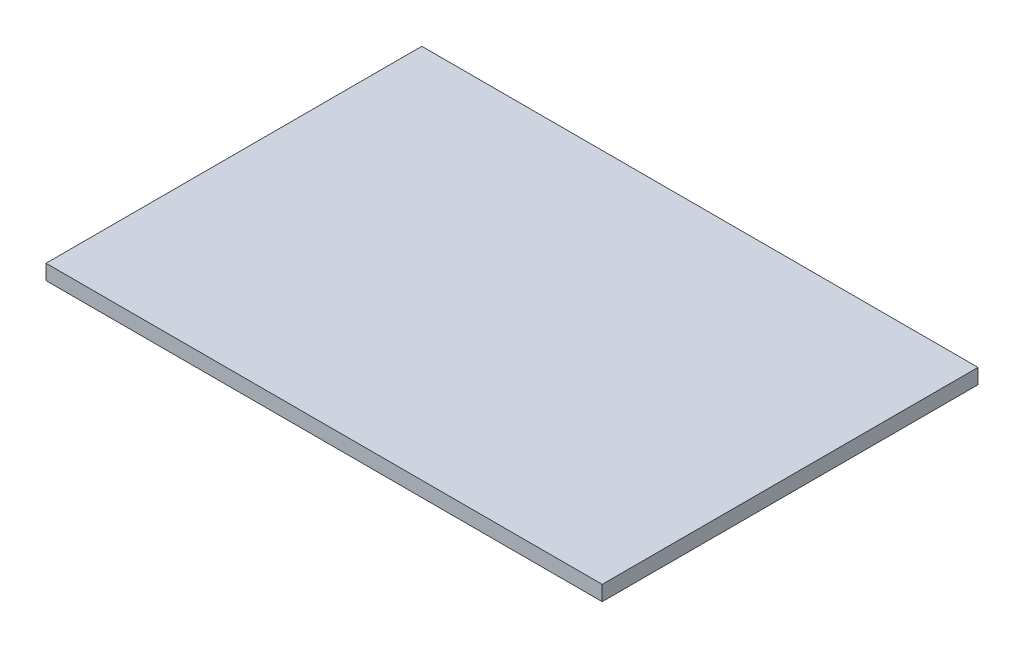
ISO-10303-21;
HEADER;
FILE_DESCRIPTION(('STEP AP214'),'2;1');
FILE_NAME('part.step','',(''),(''),'','','');
FILE_SCHEMA(('AUTOMOTIVE_DESIGN { 1 0 10303 214 1 1 1 1 }'));
ENDSEC;
DATA;
#1=APPLICATION_CONTEXT('core data for automotive mechanical design processes');
#2=APPLICATION_PROTOCOL_DEFINITION('international standard','automotive_design',2000,#1);
#3=PRODUCT_CONTEXT('',#1,'mechanical');
#4=PRODUCT('Part','Part','',(#3));
#5=PRODUCT_RELATED_PRODUCT_CATEGORY('part','',(#4));
#6=PRODUCT_DEFINITION_FORMATION('','',#4);
#7=PRODUCT_DEFINITION_CONTEXT('part definition',#1,'design');
#8=PRODUCT_DEFINITION('design','',#6,#7);
#9=PRODUCT_DEFINITION_SHAPE('','',#8);
#10=(LENGTH_UNIT() NAMED_UNIT(*) SI_UNIT(.MILLI.,.METRE.));
#11=(NAMED_UNIT(*) PLANE_ANGLE_UNIT() SI_UNIT($,.RADIAN.));
#12=(NAMED_UNIT(*) SI_UNIT($,.STERADIAN.) SOLID_ANGLE_UNIT());
#13=UNCERTAINTY_MEASURE_WITH_UNIT(LENGTH_MEASURE(1.E-05),#10,'distance_accuracy_value','');
#14=(GEOMETRIC_REPRESENTATION_CONTEXT(3) GLOBAL_UNCERTAINTY_ASSIGNED_CONTEXT((#13)) GLOBAL_UNIT_ASSIGNED_CONTEXT((#10,
#11,#12)) REPRESENTATION_CONTEXT('',''));
#15=CARTESIAN_POINT('',(0.,0.,0.));
#16=DIRECTION('',(0.,0.,1.));
#17=DIRECTION('',(1.,0.,0.));
#18=AXIS2_PLACEMENT_3D('',#15,#16,#17);
#19=CARTESIAN_POINT('',(-132.073823053412,10.,-128.97476340694));
#20=DIRECTION('',(1.,0.,0.));
#21=DIRECTION('',(0.,0.,-1.));
#22=AXIS2_PLACEMENT_3D('',#19,#20,#21);
#23=PLANE('',#22);
#24=DIRECTION('',(0.,0.,1.));
#25=VECTOR('',#24,1.);
#26=CARTESIAN_POINT('',(-132.073823053412,0.,-128.97476340694));
#27=LINE('',#26,#25);
#28=CARTESIAN_POINT('',(-132.073823053412,0.,-128.97476340694));
#29=VERTEX_POINT('',#28);
#30=CARTESIAN_POINT('',(-132.073823053412,0.,121.02523659306));
#31=VERTEX_POINT('',#30);
#32=EDGE_CURVE('E96',#29,#31,#27,.T.);
#33=ORIENTED_EDGE('',*,*,#32,.T.);
#34=DIRECTION('',(0.,-1.,0.));
#35=VECTOR('',#34,1.);
#36=CARTESIAN_POINT('',(-132.073823053412,10.,121.02523659306));
#37=LINE('',#36,#35);
#38=CARTESIAN_POINT('',(-132.073823053412,10.,121.02523659306));
#39=VERTEX_POINT('',#38);
#40=EDGE_CURVE('E11',#39,#31,#37,.T.);
#41=ORIENTED_EDGE('',*,*,#40,.F.);
#42=DIRECTION('',(0.,0.,1.));
#43=VECTOR('',#42,1.);
#44=CARTESIAN_POINT('',(-132.073823053412,10.,-128.97476340694));
#45=LINE('',#44,#43);
#46=CARTESIAN_POINT('',(-132.073823053412,10.,-128.97476340694));
#47=VERTEX_POINT('',#46);
#48=EDGE_CURVE('E84',#47,#39,#45,.T.);
#49=ORIENTED_EDGE('',*,*,#48,.F.);
#50=DIRECTION('',(0.,-1.,0.));
#51=VECTOR('',#50,1.);
#52=CARTESIAN_POINT('',(-132.073823053412,10.,-128.97476340694));
#53=LINE('',#52,#51);
#54=EDGE_CURVE('E92',#47,#29,#53,.T.);
#55=ORIENTED_EDGE('',*,*,#54,.T.);
#56=EDGE_LOOP('',(#33,#41,#49,#55));
#57=FACE_BOUND('',#56,.T.);
#58=ADVANCED_FACE('F33',(#57),#23,.F.);
#59=CARTESIAN_POINT('',(-132.073823053412,10.,121.02523659306));
#60=DIRECTION('',(0.,0.,-1.));
#61=DIRECTION('',(-1.,0.,0.));
#62=AXIS2_PLACEMENT_3D('',#59,#60,#61);
#63=PLANE('',#62);
#64=DIRECTION('',(1.,0.,0.));
#65=VECTOR('',#64,1.);
#66=CARTESIAN_POINT('',(-132.073823053412,0.,121.02523659306));
#67=LINE('',#66,#65);
#68=CARTESIAN_POINT('',(237.926176946588,0.,121.02523659306));
#69=VERTEX_POINT('',#68);
#70=EDGE_CURVE('E88',#31,#69,#67,.T.);
#71=ORIENTED_EDGE('',*,*,#70,.T.);
#72=DIRECTION('',(0.,-1.,0.));
#73=VECTOR('',#72,1.);
#74=CARTESIAN_POINT('',(237.926176946588,10.,121.02523659306));
#75=LINE('',#74,#73);
#76=CARTESIAN_POINT('',(237.926176946588,10.,121.02523659306));
#77=VERTEX_POINT('',#76);
#78=EDGE_CURVE('E41',#77,#69,#75,.T.);
#79=ORIENTED_EDGE('',*,*,#78,.F.);
#80=DIRECTION('',(1.,0.,0.));
#81=VECTOR('',#80,1.);
#82=CARTESIAN_POINT('',(-132.073823053412,10.,121.02523659306));
#83=LINE('',#82,#81);
#84=EDGE_CURVE('E79',#39,#77,#83,.T.);
#85=ORIENTED_EDGE('',*,*,#84,.F.);
#86=ORIENTED_EDGE('',*,*,#40,.T.);
#87=EDGE_LOOP('',(#71,#79,#85,#86));
#88=FACE_BOUND('',#87,.T.);
#89=ADVANCED_FACE('F87',(#88),#63,.F.);
#90=CARTESIAN_POINT('',(237.926176946588,10.,-128.97476340694));
#91=DIRECTION('',(-1.,0.,0.));
#92=DIRECTION('',(0.,0.,1.));
#93=AXIS2_PLACEMENT_3D('',#90,#91,#92);
#94=PLANE('',#93);
#95=DIRECTION('',(0.,0.,-1.));
#96=VECTOR('',#95,1.);
#97=CARTESIAN_POINT('',(237.926176946588,0.,-128.97476340694));
#98=LINE('',#97,#96);
#99=CARTESIAN_POINT('',(237.926176946588,0.,-128.97476340694));
#100=VERTEX_POINT('',#99);
#101=EDGE_CURVE('E66',#69,#100,#98,.T.);
#102=ORIENTED_EDGE('',*,*,#101,.T.);
#103=DIRECTION('',(0.,-1.,0.));
#104=VECTOR('',#103,1.);
#105=CARTESIAN_POINT('',(237.926176946588,10.,-128.97476340694));
#106=LINE('',#105,#104);
#107=CARTESIAN_POINT('',(237.926176946588,10.,-128.97476340694));
#108=VERTEX_POINT('',#107);
#109=EDGE_CURVE('E89',#108,#100,#106,.T.);
#110=ORIENTED_EDGE('',*,*,#109,.F.);
#111=DIRECTION('',(0.,0.,-1.));
#112=VECTOR('',#111,1.);
#113=CARTESIAN_POINT('',(237.926176946588,10.,-128.97476340694));
#114=LINE('',#113,#112);
#115=EDGE_CURVE('E82',#77,#108,#114,.T.);
#116=ORIENTED_EDGE('',*,*,#115,.F.);
#117=ORIENTED_EDGE('',*,*,#78,.T.);
#118=EDGE_LOOP('',(#102,#110,#116,#117));
#119=FACE_BOUND('',#118,.T.);
#120=ADVANCED_FACE('F90',(#119),#94,.F.);
#121=CARTESIAN_POINT('',(-132.073823053412,10.,-128.97476340694));
#122=DIRECTION('',(0.,0.,1.));
#123=DIRECTION('',(1.,0.,0.));
#124=AXIS2_PLACEMENT_3D('',#121,#122,#123);
#125=PLANE('',#124);
#126=DIRECTION('',(-1.,0.,0.));
#127=VECTOR('',#126,1.);
#128=CARTESIAN_POINT('',(-132.073823053412,0.,-128.97476340694));
#129=LINE('',#128,#127);
#130=EDGE_CURVE('E72',#100,#29,#129,.T.);
#131=ORIENTED_EDGE('',*,*,#130,.T.);
#132=ORIENTED_EDGE('',*,*,#54,.F.);
#133=DIRECTION('',(-1.,0.,0.));
#134=VECTOR('',#133,1.);
#135=CARTESIAN_POINT('',(-132.073823053412,10.,-128.97476340694));
#136=LINE('',#135,#134);
#137=EDGE_CURVE('E49',#108,#47,#136,.T.);
#138=ORIENTED_EDGE('',*,*,#137,.F.);
#139=ORIENTED_EDGE('',*,*,#109,.T.);
#140=EDGE_LOOP('',(#131,#132,#138,#139));
#141=FACE_BOUND('',#140,.T.);
#142=ADVANCED_FACE('F103',(#141),#125,.F.);
#143=CARTESIAN_POINT('',(0.,10.,0.));
#144=DIRECTION('',(0.,1.,0.));
#145=DIRECTION('',(0.,0.,1.));
#146=AXIS2_PLACEMENT_3D('',#143,#144,#145);
#147=PLANE('',#146);
#148=ORIENTED_EDGE('',*,*,#48,.T.);
#149=ORIENTED_EDGE('',*,*,#84,.T.);
#150=ORIENTED_EDGE('',*,*,#115,.T.);
#151=ORIENTED_EDGE('',*,*,#137,.T.);
#152=EDGE_LOOP('',(#148,#149,#150,#151));
#153=FACE_BOUND('',#152,.T.);
#154=ADVANCED_FACE('F80',(#153),#147,.T.);
#155=CARTESIAN_POINT('',(0.,0.,0.));
#156=DIRECTION('',(0.,1.,0.));
#157=DIRECTION('',(0.,0.,1.));
#158=AXIS2_PLACEMENT_3D('',#155,#156,#157);
#159=PLANE('',#158);
#160=ORIENTED_EDGE('',*,*,#32,.F.);
#161=ORIENTED_EDGE('',*,*,#130,.F.);
#162=ORIENTED_EDGE('',*,*,#101,.F.);
#163=ORIENTED_EDGE('',*,*,#70,.F.);
#164=EDGE_LOOP('',(#160,#161,#162,#163));
#165=FACE_BOUND('',#164,.T.);
#166=ADVANCED_FACE('F106',(#165),#159,.F.);
#167=CLOSED_SHELL('',(#58,#89,#120,#142,#154,#166));
#168=MANIFOLD_SOLID_BREP('B2',#167);
#169=ADVANCED_BREP_SHAPE_REPRESENTATION('',(#18,#168),#14);
#170=SHAPE_DEFINITION_REPRESENTATION(#9,#169);
ENDSEC;
END-ISO-10303-21;
